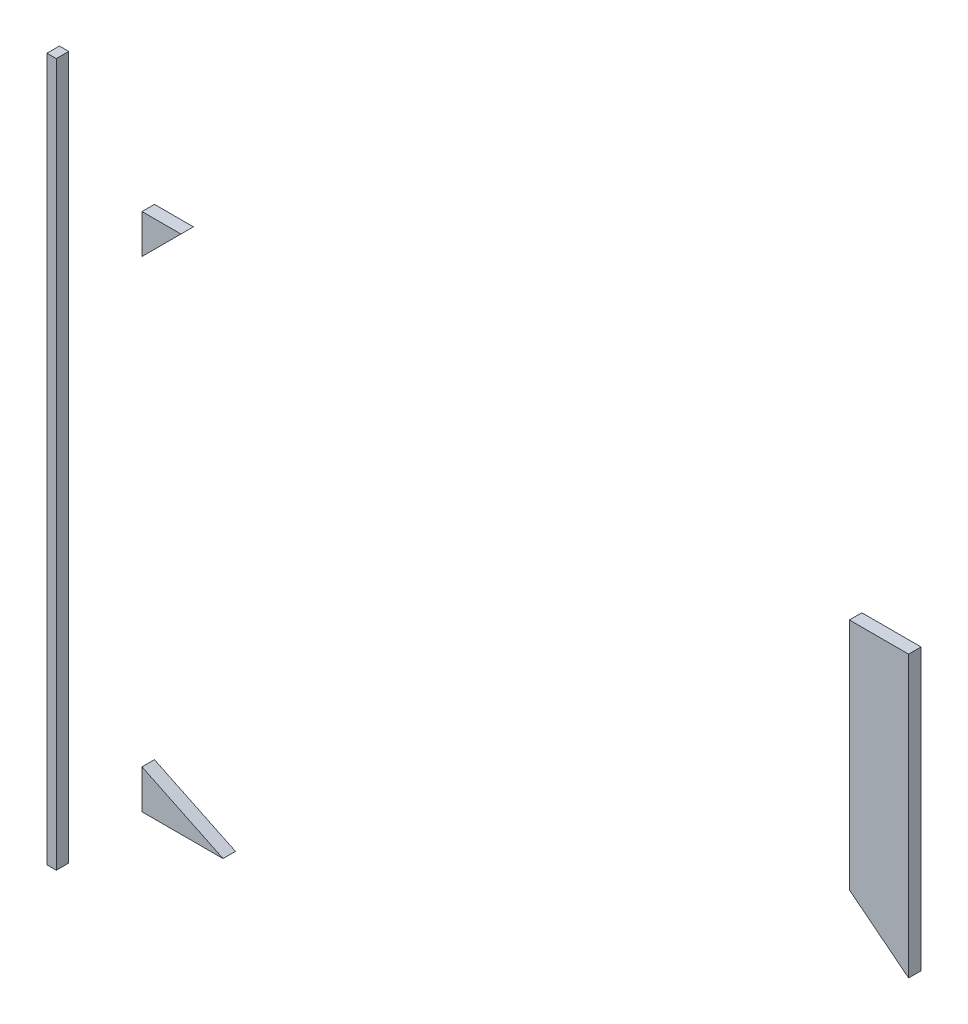
ISO-10303-21;
HEADER;
FILE_DESCRIPTION(('STEP AP214'),'2;1');
FILE_NAME('part.step','',(''),(''),'','','');
FILE_SCHEMA(('AUTOMOTIVE_DESIGN { 1 0 10303 214 1 1 1 1 }'));
ENDSEC;
DATA;
#1=APPLICATION_CONTEXT('core data for automotive mechanical design processes');
#2=APPLICATION_PROTOCOL_DEFINITION('international standard','automotive_design',2000,#1);
#3=PRODUCT_CONTEXT('',#1,'mechanical');
#4=PRODUCT('Part','Part','',(#3));
#5=PRODUCT_RELATED_PRODUCT_CATEGORY('part','',(#4));
#6=PRODUCT_DEFINITION_FORMATION('','',#4);
#7=PRODUCT_DEFINITION_CONTEXT('part definition',#1,'design');
#8=PRODUCT_DEFINITION('design','',#6,#7);
#9=PRODUCT_DEFINITION_SHAPE('','',#8);
#10=(LENGTH_UNIT() NAMED_UNIT(*) SI_UNIT(.MILLI.,.METRE.));
#11=(NAMED_UNIT(*) PLANE_ANGLE_UNIT() SI_UNIT($,.RADIAN.));
#12=(NAMED_UNIT(*) SI_UNIT($,.STERADIAN.) SOLID_ANGLE_UNIT());
#13=UNCERTAINTY_MEASURE_WITH_UNIT(LENGTH_MEASURE(1.E-05),#10,'distance_accuracy_value','');
#14=(GEOMETRIC_REPRESENTATION_CONTEXT(3) GLOBAL_UNCERTAINTY_ASSIGNED_CONTEXT((#13)) GLOBAL_UNIT_ASSIGNED_CONTEXT((#10,
#11,#12)) REPRESENTATION_CONTEXT('',''));
#15=CARTESIAN_POINT('',(0.,0.,0.));
#16=DIRECTION('',(0.,0.,1.));
#17=DIRECTION('',(1.,0.,0.));
#18=AXIS2_PLACEMENT_3D('',#15,#16,#17);
#19=CARTESIAN_POINT('',(-85.4999999848123,-45.4909497582359,0.));
#20=DIRECTION('',(1.,0.,0.));
#21=DIRECTION('',(0.,0.,-1.));
#22=AXIS2_PLACEMENT_3D('',#19,#20,#21);
#23=PLANE('',#22);
#24=DIRECTION('',(0.,1.,0.));
#25=VECTOR('',#24,1.);
#26=CARTESIAN_POINT('',(-85.4999999848123,-45.4909497582359,8.));
#27=LINE('',#26,#25);
#28=CARTESIAN_POINT('',(-85.4999999848123,-45.4909497582359,8.));
#29=VERTEX_POINT('',#28);
#30=CARTESIAN_POINT('',(-85.4999999848123,405.641377992683,8.));
#31=VERTEX_POINT('',#30);
#32=EDGE_CURVE('E110',#29,#31,#27,.T.);
#33=ORIENTED_EDGE('',*,*,#32,.F.);
#34=DIRECTION('',(0.,0.,1.));
#35=VECTOR('',#34,1.);
#36=CARTESIAN_POINT('',(-85.4999999848123,-45.4909497582359,0.));
#37=LINE('',#36,#35);
#38=CARTESIAN_POINT('',(-85.4999999848123,-45.4909497582359,0.));
#39=VERTEX_POINT('',#38);
#40=EDGE_CURVE('E12',#39,#29,#37,.T.);
#41=ORIENTED_EDGE('',*,*,#40,.F.);
#42=DIRECTION('',(0.,1.,0.));
#43=VECTOR('',#42,1.);
#44=CARTESIAN_POINT('',(-85.4999999848123,-45.4909497582359,0.));
#45=LINE('',#44,#43);
#46=CARTESIAN_POINT('',(-85.4999999848123,405.641377992683,0.));
#47=VERTEX_POINT('',#46);
#48=EDGE_CURVE('E104',#39,#47,#45,.T.);
#49=ORIENTED_EDGE('',*,*,#48,.T.);
#50=DIRECTION('',(0.,0.,1.));
#51=VECTOR('',#50,1.);
#52=CARTESIAN_POINT('',(-85.4999999848123,405.641377992683,0.));
#53=LINE('',#52,#51);
#54=EDGE_CURVE('E49',#47,#31,#53,.T.);
#55=ORIENTED_EDGE('',*,*,#54,.T.);
#56=EDGE_LOOP('',(#33,#41,#49,#55));
#57=FACE_BOUND('',#56,.T.);
#58=ADVANCED_FACE('F46',(#57),#23,.T.);
#59=CARTESIAN_POINT('',(-85.4999999848123,-45.4909497582359,0.));
#60=DIRECTION('',(0.,-1.,0.));
#61=DIRECTION('',(0.,0.,-1.));
#62=AXIS2_PLACEMENT_3D('',#59,#60,#61);
#63=PLANE('',#62);
#64=DIRECTION('',(1.,0.,0.));
#65=VECTOR('',#64,1.);
#66=CARTESIAN_POINT('',(-85.4999999848123,-45.4909497582359,8.));
#67=LINE('',#66,#65);
#68=CARTESIAN_POINT('',(-91.4999999848118,-45.4909497582359,8.));
#69=VERTEX_POINT('',#68);
#70=EDGE_CURVE('E106',#69,#29,#67,.T.);
#71=ORIENTED_EDGE('',*,*,#70,.F.);
#72=DIRECTION('',(0.,0.,1.));
#73=VECTOR('',#72,1.);
#74=CARTESIAN_POINT('',(-91.4999999848118,-45.4909497582359,0.));
#75=LINE('',#74,#73);
#76=CARTESIAN_POINT('',(-91.4999999848118,-45.4909497582359,0.));
#77=VERTEX_POINT('',#76);
#78=EDGE_CURVE('E55',#77,#69,#75,.T.);
#79=ORIENTED_EDGE('',*,*,#78,.F.);
#80=DIRECTION('',(1.,0.,0.));
#81=VECTOR('',#80,1.);
#82=CARTESIAN_POINT('',(-85.4999999848123,-45.4909497582359,0.));
#83=LINE('',#82,#81);
#84=EDGE_CURVE('E101',#77,#39,#83,.T.);
#85=ORIENTED_EDGE('',*,*,#84,.T.);
#86=ORIENTED_EDGE('',*,*,#40,.T.);
#87=EDGE_LOOP('',(#71,#79,#85,#86));
#88=FACE_BOUND('',#87,.T.);
#89=ADVANCED_FACE('F120',(#88),#63,.T.);
#90=CARTESIAN_POINT('',(-91.4999999848118,-45.4909497582359,0.));
#91=DIRECTION('',(-1.,0.,0.));
#92=DIRECTION('',(0.,0.,1.));
#93=AXIS2_PLACEMENT_3D('',#90,#91,#92);
#94=PLANE('',#93);
#95=DIRECTION('',(0.,-1.,0.));
#96=VECTOR('',#95,1.);
#97=CARTESIAN_POINT('',(-91.4999999848118,-45.4909497582359,8.));
#98=LINE('',#97,#96);
#99=CARTESIAN_POINT('',(-91.4999999848118,405.641377992683,8.));
#100=VERTEX_POINT('',#99);
#101=EDGE_CURVE('E96',#100,#69,#98,.T.);
#102=ORIENTED_EDGE('',*,*,#101,.F.);
#103=DIRECTION('',(0.,0.,1.));
#104=VECTOR('',#103,1.);
#105=CARTESIAN_POINT('',(-91.4999999848118,405.641377992683,0.));
#106=LINE('',#105,#104);
#107=CARTESIAN_POINT('',(-91.4999999848118,405.641377992683,0.));
#108=VERTEX_POINT('',#107);
#109=EDGE_CURVE('E91',#108,#100,#106,.T.);
#110=ORIENTED_EDGE('',*,*,#109,.F.);
#111=DIRECTION('',(0.,-1.,0.));
#112=VECTOR('',#111,1.);
#113=CARTESIAN_POINT('',(-91.4999999848118,-45.4909497582359,0.));
#114=LINE('',#113,#112);
#115=EDGE_CURVE('E94',#108,#77,#114,.T.);
#116=ORIENTED_EDGE('',*,*,#115,.T.);
#117=ORIENTED_EDGE('',*,*,#78,.T.);
#118=EDGE_LOOP('',(#102,#110,#116,#117));
#119=FACE_BOUND('',#118,.T.);
#120=ADVANCED_FACE('F93',(#119),#94,.T.);
#121=CARTESIAN_POINT('',(-85.4999999848123,405.641377992683,0.));
#122=DIRECTION('',(0.,1.,0.));
#123=DIRECTION('',(0.,0.,1.));
#124=AXIS2_PLACEMENT_3D('',#121,#122,#123);
#125=PLANE('',#124);
#126=DIRECTION('',(-1.,0.,0.));
#127=VECTOR('',#126,1.);
#128=CARTESIAN_POINT('',(-85.4999999848123,405.641377992683,8.));
#129=LINE('',#128,#127);
#130=EDGE_CURVE('E113',#31,#100,#129,.T.);
#131=ORIENTED_EDGE('',*,*,#130,.F.);
#132=ORIENTED_EDGE('',*,*,#54,.F.);
#133=DIRECTION('',(-1.,0.,0.));
#134=VECTOR('',#133,1.);
#135=CARTESIAN_POINT('',(-85.4999999848123,405.641377992683,0.));
#136=LINE('',#135,#134);
#137=EDGE_CURVE('E100',#47,#108,#136,.T.);
#138=ORIENTED_EDGE('',*,*,#137,.T.);
#139=ORIENTED_EDGE('',*,*,#109,.T.);
#140=EDGE_LOOP('',(#131,#132,#138,#139));
#141=FACE_BOUND('',#140,.T.);
#142=ADVANCED_FACE('F103',(#141),#125,.T.);
#143=CARTESIAN_POINT('',(0.,0.,0.));
#144=DIRECTION('',(0.,0.,1.));
#145=DIRECTION('',(1.,0.,0.));
#146=AXIS2_PLACEMENT_3D('',#143,#144,#145);
#147=PLANE('',#146);
#148=ORIENTED_EDGE('',*,*,#48,.F.);
#149=ORIENTED_EDGE('',*,*,#84,.F.);
#150=ORIENTED_EDGE('',*,*,#115,.F.);
#151=ORIENTED_EDGE('',*,*,#137,.F.);
#152=EDGE_LOOP('',(#148,#149,#150,#151));
#153=FACE_BOUND('',#152,.T.);
#154=ADVANCED_FACE('F99',(#153),#147,.F.);
#155=CARTESIAN_POINT('',(0.,0.,8.));
#156=DIRECTION('',(0.,0.,1.));
#157=DIRECTION('',(1.,0.,0.));
#158=AXIS2_PLACEMENT_3D('',#155,#156,#157);
#159=PLANE('',#158);
#160=ORIENTED_EDGE('',*,*,#32,.T.);
#161=ORIENTED_EDGE('',*,*,#130,.T.);
#162=ORIENTED_EDGE('',*,*,#101,.T.);
#163=ORIENTED_EDGE('',*,*,#70,.T.);
#164=EDGE_LOOP('',(#160,#161,#162,#163));
#165=FACE_BOUND('',#164,.T.);
#166=ADVANCED_FACE('F119',(#165),#159,.T.);
#167=CLOSED_SHELL('',(#58,#89,#120,#142,#154,#166));
#168=MANIFOLD_SOLID_BREP('B2',#167);
#169=CARTESIAN_POINT('',(461.500000011823,348.138361245429,0.));
#170=DIRECTION('',(0.,1.,0.));
#171=DIRECTION('',(0.,0.,1.));
#172=AXIS2_PLACEMENT_3D('',#169,#170,#171);
#173=PLANE('',#172);
#174=DIRECTION('',(-1.,0.,0.));
#175=VECTOR('',#174,1.);
#176=CARTESIAN_POINT('',(461.500000011823,348.138361245429,8.));
#177=LINE('',#176,#175);
#178=CARTESIAN_POINT('',(461.500000011823,348.138361245429,8.));
#179=VERTEX_POINT('',#178);
#180=CARTESIAN_POINT('',(423.500000015184,348.138361245429,8.));
#181=VERTEX_POINT('',#180);
#182=EDGE_CURVE('E246',#179,#181,#177,.T.);
#183=ORIENTED_EDGE('',*,*,#182,.F.);
#184=DIRECTION('',(0.,0.,1.));
#185=VECTOR('',#184,1.);
#186=CARTESIAN_POINT('',(461.500000011823,348.138361245429,0.));
#187=LINE('',#186,#185);
#188=CARTESIAN_POINT('',(461.500000011823,348.138361245429,0.));
#189=VERTEX_POINT('',#188);
#190=EDGE_CURVE('E44',#189,#179,#187,.T.);
#191=ORIENTED_EDGE('',*,*,#190,.F.);
#192=DIRECTION('',(-1.,0.,0.));
#193=VECTOR('',#192,1.);
#194=CARTESIAN_POINT('',(461.500000011823,348.138361245429,0.));
#195=LINE('',#194,#193);
#196=CARTESIAN_POINT('',(423.500000015184,348.138361245429,0.));
#197=VERTEX_POINT('',#196);
#198=EDGE_CURVE('E240',#189,#197,#195,.T.);
#199=ORIENTED_EDGE('',*,*,#198,.T.);
#200=DIRECTION('',(0.,0.,1.));
#201=VECTOR('',#200,1.);
#202=CARTESIAN_POINT('',(423.500000015184,348.138361245429,0.));
#203=LINE('',#202,#201);
#204=EDGE_CURVE('E185',#197,#181,#203,.T.);
#205=ORIENTED_EDGE('',*,*,#204,.T.);
#206=EDGE_LOOP('',(#183,#191,#199,#205));
#207=FACE_BOUND('',#206,.T.);
#208=ADVANCED_FACE('F182',(#207),#173,.T.);
#209=CARTESIAN_POINT('',(461.500000015184,168.138361245429,0.));
#210=DIRECTION('',(1.,1.86739512741951E-11,0.));
#211=DIRECTION('',(-1.86739512741951E-11,1.,0.));
#212=AXIS2_PLACEMENT_3D('',#209,#210,#211);
#213=PLANE('',#212);
#214=DIRECTION('',(-1.86739512741951E-11,1.,0.));
#215=VECTOR('',#214,1.);
#216=CARTESIAN_POINT('',(461.500000015184,168.138361245429,8.));
#217=LINE('',#216,#215);
#218=CARTESIAN_POINT('',(461.500000015184,168.138361245429,8.));
#219=VERTEX_POINT('',#218);
#220=EDGE_CURVE('E242',#219,#179,#217,.T.);
#221=ORIENTED_EDGE('',*,*,#220,.F.);
#222=DIRECTION('',(0.,0.,1.));
#223=VECTOR('',#222,1.);
#224=CARTESIAN_POINT('',(461.500000015184,168.138361245429,0.));
#225=LINE('',#224,#223);
#226=CARTESIAN_POINT('',(461.500000015184,168.138361245429,0.));
#227=VERTEX_POINT('',#226);
#228=EDGE_CURVE('E191',#227,#219,#225,.T.);
#229=ORIENTED_EDGE('',*,*,#228,.F.);
#230=DIRECTION('',(-1.86739512741951E-11,1.,0.));
#231=VECTOR('',#230,1.);
#232=CARTESIAN_POINT('',(461.500000015184,168.138361245429,0.));
#233=LINE('',#232,#231);
#234=EDGE_CURVE('E237',#227,#189,#233,.T.);
#235=ORIENTED_EDGE('',*,*,#234,.T.);
#236=ORIENTED_EDGE('',*,*,#190,.T.);
#237=EDGE_LOOP('',(#221,#229,#235,#236));
#238=FACE_BOUND('',#237,.T.);
#239=ADVANCED_FACE('F256',(#238),#213,.T.);
#240=CARTESIAN_POINT('',(423.500000015184,198.138361245429,0.));
#241=DIRECTION('',(-0.619644288579021,-0.784882765533426,0.));
#242=DIRECTION('',(0.784882765533426,-0.619644288579021,0.));
#243=AXIS2_PLACEMENT_3D('',#240,#241,#242);
#244=PLANE('',#243);
#245=DIRECTION('',(0.784882765533426,-0.619644288579021,0.));
#246=VECTOR('',#245,1.);
#247=CARTESIAN_POINT('',(423.500000015184,198.138361245429,8.));
#248=LINE('',#247,#246);
#249=CARTESIAN_POINT('',(423.500000015184,198.138361245429,8.));
#250=VERTEX_POINT('',#249);
#251=EDGE_CURVE('E232',#250,#219,#248,.T.);
#252=ORIENTED_EDGE('',*,*,#251,.F.);
#253=DIRECTION('',(0.,0.,1.));
#254=VECTOR('',#253,1.);
#255=CARTESIAN_POINT('',(423.500000015184,198.138361245429,0.));
#256=LINE('',#255,#254);
#257=CARTESIAN_POINT('',(423.500000015184,198.138361245429,0.));
#258=VERTEX_POINT('',#257);
#259=EDGE_CURVE('E227',#258,#250,#256,.T.);
#260=ORIENTED_EDGE('',*,*,#259,.F.);
#261=DIRECTION('',(0.784882765533426,-0.619644288579021,0.));
#262=VECTOR('',#261,1.);
#263=CARTESIAN_POINT('',(423.500000015184,198.138361245429,0.));
#264=LINE('',#263,#262);
#265=EDGE_CURVE('E230',#258,#227,#264,.T.);
#266=ORIENTED_EDGE('',*,*,#265,.T.);
#267=ORIENTED_EDGE('',*,*,#228,.T.);
#268=EDGE_LOOP('',(#252,#260,#266,#267));
#269=FACE_BOUND('',#268,.T.);
#270=ADVANCED_FACE('F229',(#269),#244,.T.);
#271=CARTESIAN_POINT('',(423.500000015184,348.138361245429,0.));
#272=DIRECTION('',(-1.,0.,0.));
#273=DIRECTION('',(0.,0.,1.));
#274=AXIS2_PLACEMENT_3D('',#271,#272,#273);
#275=PLANE('',#274);
#276=DIRECTION('',(0.,-1.,0.));
#277=VECTOR('',#276,1.);
#278=CARTESIAN_POINT('',(423.500000015184,348.138361245429,8.));
#279=LINE('',#278,#277);
#280=EDGE_CURVE('E249',#181,#250,#279,.T.);
#281=ORIENTED_EDGE('',*,*,#280,.F.);
#282=ORIENTED_EDGE('',*,*,#204,.F.);
#283=DIRECTION('',(0.,-1.,0.));
#284=VECTOR('',#283,1.);
#285=CARTESIAN_POINT('',(423.500000015184,348.138361245429,0.));
#286=LINE('',#285,#284);
#287=EDGE_CURVE('E236',#197,#258,#286,.T.);
#288=ORIENTED_EDGE('',*,*,#287,.T.);
#289=ORIENTED_EDGE('',*,*,#259,.T.);
#290=EDGE_LOOP('',(#281,#282,#288,#289));
#291=FACE_BOUND('',#290,.T.);
#292=ADVANCED_FACE('F239',(#291),#275,.T.);
#293=CARTESIAN_POINT('',(0.,0.,0.));
#294=DIRECTION('',(0.,0.,1.));
#295=DIRECTION('',(1.,0.,0.));
#296=AXIS2_PLACEMENT_3D('',#293,#294,#295);
#297=PLANE('',#296);
#298=ORIENTED_EDGE('',*,*,#198,.F.);
#299=ORIENTED_EDGE('',*,*,#234,.F.);
#300=ORIENTED_EDGE('',*,*,#265,.F.);
#301=ORIENTED_EDGE('',*,*,#287,.F.);
#302=EDGE_LOOP('',(#298,#299,#300,#301));
#303=FACE_BOUND('',#302,.T.);
#304=ADVANCED_FACE('F235',(#303),#297,.F.);
#305=CARTESIAN_POINT('',(0.,0.,8.));
#306=DIRECTION('',(0.,0.,1.));
#307=DIRECTION('',(1.,0.,0.));
#308=AXIS2_PLACEMENT_3D('',#305,#306,#307);
#309=PLANE('',#308);
#310=ORIENTED_EDGE('',*,*,#182,.T.);
#311=ORIENTED_EDGE('',*,*,#280,.T.);
#312=ORIENTED_EDGE('',*,*,#251,.T.);
#313=ORIENTED_EDGE('',*,*,#220,.T.);
#314=EDGE_LOOP('',(#310,#311,#312,#313));
#315=FACE_BOUND('',#314,.T.);
#316=ADVANCED_FACE('F255',(#315),#309,.T.);
#317=CLOSED_SHELL('',(#208,#239,#270,#292,#304,#316));
#318=MANIFOLD_SOLID_BREP('B6',#317);
#319=CARTESIAN_POINT('',(-30.4999999881738,348.138361245429,0.));
#320=DIRECTION('',(-1.,0.,0.));
#321=DIRECTION('',(0.,-1.,0.));
#322=AXIS2_PLACEMENT_3D('',#319,#320,#321);
#323=PLANE('',#322);
#324=DIRECTION('',(0.,-1.,0.));
#325=VECTOR('',#324,1.);
#326=CARTESIAN_POINT('',(-30.4999999881738,348.138361245429,8.));
#327=LINE('',#326,#325);
#328=CARTESIAN_POINT('',(-30.4999999881738,348.138361245429,8.));
#329=VERTEX_POINT('',#328);
#330=CARTESIAN_POINT('',(-30.4999999881738,323.138361245429,8.));
#331=VERTEX_POINT('',#330);
#332=EDGE_CURVE('E371',#329,#331,#327,.T.);
#333=ORIENTED_EDGE('',*,*,#332,.F.);
#334=DIRECTION('',(0.,0.,1.));
#335=VECTOR('',#334,1.);
#336=CARTESIAN_POINT('',(-30.4999999881738,348.138361245429,0.));
#337=LINE('',#336,#335);
#338=CARTESIAN_POINT('',(-30.4999999881738,348.138361245429,0.));
#339=VERTEX_POINT('',#338);
#340=EDGE_CURVE('E180',#339,#329,#337,.T.);
#341=ORIENTED_EDGE('',*,*,#340,.F.);
#342=DIRECTION('',(0.,-1.,0.));
#343=VECTOR('',#342,1.);
#344=CARTESIAN_POINT('',(-30.4999999881738,348.138361245429,0.));
#345=LINE('',#344,#343);
#346=CARTESIAN_POINT('',(-30.4999999881738,323.138361245429,0.));
#347=VERTEX_POINT('',#346);
#348=EDGE_CURVE('E363',#339,#347,#345,.T.);
#349=ORIENTED_EDGE('',*,*,#348,.T.);
#350=DIRECTION('',(0.,0.,1.));
#351=VECTOR('',#350,1.);
#352=CARTESIAN_POINT('',(-30.4999999881738,323.138361245429,0.));
#353=LINE('',#352,#351);
#354=EDGE_CURVE('E322',#347,#331,#353,.T.);
#355=ORIENTED_EDGE('',*,*,#354,.T.);
#356=EDGE_LOOP('',(#333,#341,#349,#355));
#357=FACE_BOUND('',#356,.T.);
#358=ADVANCED_FACE('F319',(#357),#323,.T.);
#359=CARTESIAN_POINT('',(-5.49999998817376,348.138361245429,0.));
#360=DIRECTION('',(0.,1.,0.));
#361=DIRECTION('',(0.,0.,1.));
#362=AXIS2_PLACEMENT_3D('',#359,#360,#361);
#363=PLANE('',#362);
#364=DIRECTION('',(-1.,0.,0.));
#365=VECTOR('',#364,1.);
#366=CARTESIAN_POINT('',(-5.49999998817376,348.138361245429,8.));
#367=LINE('',#366,#365);
#368=CARTESIAN_POINT('',(-5.49999998817376,348.138361245429,8.));
#369=VERTEX_POINT('',#368);
#370=EDGE_CURVE('E365',#369,#329,#367,.T.);
#371=ORIENTED_EDGE('',*,*,#370,.F.);
#372=DIRECTION('',(0.,0.,1.));
#373=VECTOR('',#372,1.);
#374=CARTESIAN_POINT('',(-5.49999998817376,348.138361245429,0.));
#375=LINE('',#374,#373);
#376=CARTESIAN_POINT('',(-5.49999998817376,348.138361245429,0.));
#377=VERTEX_POINT('',#376);
#378=EDGE_CURVE('E328',#377,#369,#375,.T.);
#379=ORIENTED_EDGE('',*,*,#378,.F.);
#380=DIRECTION('',(-1.,0.,0.));
#381=VECTOR('',#380,1.);
#382=CARTESIAN_POINT('',(-5.49999998817376,348.138361245429,0.));
#383=LINE('',#382,#381);
#384=EDGE_CURVE('E360',#377,#339,#383,.T.);
#385=ORIENTED_EDGE('',*,*,#384,.T.);
#386=ORIENTED_EDGE('',*,*,#340,.T.);
#387=EDGE_LOOP('',(#371,#379,#385,#386));
#388=FACE_BOUND('',#387,.T.);
#389=ADVANCED_FACE('F375',(#388),#363,.T.);
#390=CARTESIAN_POINT('',(-30.4999999881738,323.138361245429,0.));
#391=DIRECTION('',(0.707106781186548,-0.707106781186547,0.));
#392=DIRECTION('',(0.707106781186547,0.707106781186548,0.));
#393=AXIS2_PLACEMENT_3D('',#390,#391,#392);
#394=PLANE('',#393);
#395=DIRECTION('',(0.707106781186547,0.707106781186548,0.));
#396=VECTOR('',#395,1.);
#397=CARTESIAN_POINT('',(-30.4999999881738,323.138361245429,8.));
#398=LINE('',#397,#396);
#399=EDGE_CURVE('E358',#331,#369,#398,.T.);
#400=ORIENTED_EDGE('',*,*,#399,.F.);
#401=ORIENTED_EDGE('',*,*,#354,.F.);
#402=DIRECTION('',(0.707106781186547,0.707106781186548,0.));
#403=VECTOR('',#402,1.);
#404=CARTESIAN_POINT('',(-30.4999999881738,323.138361245429,0.));
#405=LINE('',#404,#403);
#406=EDGE_CURVE('E356',#347,#377,#405,.T.);
#407=ORIENTED_EDGE('',*,*,#406,.T.);
#408=ORIENTED_EDGE('',*,*,#378,.T.);
#409=EDGE_LOOP('',(#400,#401,#407,#408));
#410=FACE_BOUND('',#409,.T.);
#411=ADVANCED_FACE('F355',(#410),#394,.T.);
#412=CARTESIAN_POINT('',(0.,0.,0.));
#413=DIRECTION('',(0.,0.,-1.));
#414=DIRECTION('',(-1.,0.,0.));
#415=AXIS2_PLACEMENT_3D('',#412,#413,#414);
#416=PLANE('',#415);
#417=ORIENTED_EDGE('',*,*,#348,.F.);
#418=ORIENTED_EDGE('',*,*,#384,.F.);
#419=ORIENTED_EDGE('',*,*,#406,.F.);
#420=EDGE_LOOP('',(#417,#418,#419));
#421=FACE_BOUND('',#420,.T.);
#422=ADVANCED_FACE('F362',(#421),#416,.T.);
#423=CARTESIAN_POINT('',(0.,0.,8.));
#424=DIRECTION('',(0.,0.,-1.));
#425=DIRECTION('',(-1.,0.,0.));
#426=AXIS2_PLACEMENT_3D('',#423,#424,#425);
#427=PLANE('',#426);
#428=ORIENTED_EDGE('',*,*,#332,.T.);
#429=ORIENTED_EDGE('',*,*,#399,.T.);
#430=ORIENTED_EDGE('',*,*,#370,.T.);
#431=EDGE_LOOP('',(#428,#429,#430));
#432=FACE_BOUND('',#431,.T.);
#433=ADVANCED_FACE('F374',(#432),#427,.F.);
#434=CLOSED_SHELL('',(#358,#389,#411,#422,#433));
#435=MANIFOLD_SOLID_BREP('B38',#434);
#436=CARTESIAN_POINT('',(-30.4999999848125,14.5090502417639,0.));
#437=DIRECTION('',(-1.,-1.34452310396327E-10,0.));
#438=DIRECTION('',(1.34452310396327E-10,-1.,0.));
#439=AXIS2_PLACEMENT_3D('',#436,#437,#438);
#440=PLANE('',#439);
#441=DIRECTION('',(1.34452310396327E-10,-1.,0.));
#442=VECTOR('',#441,1.);
#443=CARTESIAN_POINT('',(-30.4999999848125,14.5090502417639,8.));
#444=LINE('',#443,#442);
#445=CARTESIAN_POINT('',(-30.4999999881738,39.5090502417639,8.));
#446=VERTEX_POINT('',#445);
#447=CARTESIAN_POINT('',(-30.4999999848125,14.5090502417639,8.));
#448=VERTEX_POINT('',#447);
#449=EDGE_CURVE('E471',#446,#448,#444,.T.);
#450=ORIENTED_EDGE('',*,*,#449,.F.);
#451=DIRECTION('',(0.,0.,1.));
#452=VECTOR('',#451,1.);
#453=CARTESIAN_POINT('',(-30.4999999881738,39.5090502417639,0.));
#454=LINE('',#453,#452);
#455=CARTESIAN_POINT('',(-30.4999999881738,39.5090502417639,0.));
#456=VERTEX_POINT('',#455);
#457=EDGE_CURVE('E317',#456,#446,#454,.T.);
#458=ORIENTED_EDGE('',*,*,#457,.F.);
#459=DIRECTION('',(1.34452310396327E-10,-1.,0.));
#460=VECTOR('',#459,1.);
#461=CARTESIAN_POINT('',(-30.4999999848125,14.5090502417639,0.));
#462=LINE('',#461,#460);
#463=CARTESIAN_POINT('',(-30.4999999848125,14.5090502417639,0.));
#464=VERTEX_POINT('',#463);
#465=EDGE_CURVE('E463',#456,#464,#462,.T.);
#466=ORIENTED_EDGE('',*,*,#465,.T.);
#467=DIRECTION('',(0.,0.,1.));
#468=VECTOR('',#467,1.);
#469=CARTESIAN_POINT('',(-30.4999999848125,14.5090502417639,0.));
#470=LINE('',#469,#468);
#471=EDGE_CURVE('E422',#464,#448,#470,.T.);
#472=ORIENTED_EDGE('',*,*,#471,.T.);
#473=EDGE_LOOP('',(#450,#458,#466,#472));
#474=FACE_BOUND('',#473,.T.);
#475=ADVANCED_FACE('F419',(#474),#440,.T.);
#476=CARTESIAN_POINT('',(-30.4999999881738,39.5090502417639,0.));
#477=DIRECTION('',(0.433294434845128,0.901252424536124,0.));
#478=DIRECTION('',(-0.901252424536124,0.433294434845128,0.));
#479=AXIS2_PLACEMENT_3D('',#476,#477,#478);
#480=PLANE('',#479);
#481=DIRECTION('',(-0.901252424536124,0.433294434845128,0.));
#482=VECTOR('',#481,1.);
#483=CARTESIAN_POINT('',(-30.4999999881738,39.5090502417639,8.));
#484=LINE('',#483,#482);
#485=CARTESIAN_POINT('',(21.5000000151875,14.5090502417639,8.));
#486=VERTEX_POINT('',#485);
#487=EDGE_CURVE('E465',#486,#446,#484,.T.);
#488=ORIENTED_EDGE('',*,*,#487,.F.);
#489=DIRECTION('',(0.,0.,1.));
#490=VECTOR('',#489,1.);
#491=CARTESIAN_POINT('',(21.5000000151875,14.5090502417639,0.));
#492=LINE('',#491,#490);
#493=CARTESIAN_POINT('',(21.5000000151875,14.5090502417639,0.));
#494=VERTEX_POINT('',#493);
#495=EDGE_CURVE('E428',#494,#486,#492,.T.);
#496=ORIENTED_EDGE('',*,*,#495,.F.);
#497=DIRECTION('',(-0.901252424536124,0.433294434845128,0.));
#498=VECTOR('',#497,1.);
#499=CARTESIAN_POINT('',(-30.4999999881738,39.5090502417639,0.));
#500=LINE('',#499,#498);
#501=EDGE_CURVE('E460',#494,#456,#500,.T.);
#502=ORIENTED_EDGE('',*,*,#501,.T.);
#503=ORIENTED_EDGE('',*,*,#457,.T.);
#504=EDGE_LOOP('',(#488,#496,#502,#503));
#505=FACE_BOUND('',#504,.T.);
#506=ADVANCED_FACE('F475',(#505),#480,.T.);
#507=CARTESIAN_POINT('',(21.5000000151875,14.5090502417639,0.));
#508=DIRECTION('',(0.,-1.,0.));
#509=DIRECTION('',(0.,0.,-1.));
#510=AXIS2_PLACEMENT_3D('',#507,#508,#509);
#511=PLANE('',#510);
#512=DIRECTION('',(1.,0.,0.));
#513=VECTOR('',#512,1.);
#514=CARTESIAN_POINT('',(21.5000000151875,14.5090502417639,8.));
#515=LINE('',#514,#513);
#516=EDGE_CURVE('E458',#448,#486,#515,.T.);
#517=ORIENTED_EDGE('',*,*,#516,.F.);
#518=ORIENTED_EDGE('',*,*,#471,.F.);
#519=DIRECTION('',(1.,0.,0.));
#520=VECTOR('',#519,1.);
#521=CARTESIAN_POINT('',(21.5000000151875,14.5090502417639,0.));
#522=LINE('',#521,#520);
#523=EDGE_CURVE('E456',#464,#494,#522,.T.);
#524=ORIENTED_EDGE('',*,*,#523,.T.);
#525=ORIENTED_EDGE('',*,*,#495,.T.);
#526=EDGE_LOOP('',(#517,#518,#524,#525));
#527=FACE_BOUND('',#526,.T.);
#528=ADVANCED_FACE('F455',(#527),#511,.T.);
#529=CARTESIAN_POINT('',(0.,0.,0.));
#530=DIRECTION('',(0.,0.,1.));
#531=DIRECTION('',(1.,0.,0.));
#532=AXIS2_PLACEMENT_3D('',#529,#530,#531);
#533=PLANE('',#532);
#534=ORIENTED_EDGE('',*,*,#465,.F.);
#535=ORIENTED_EDGE('',*,*,#501,.F.);
#536=ORIENTED_EDGE('',*,*,#523,.F.);
#537=EDGE_LOOP('',(#534,#535,#536));
#538=FACE_BOUND('',#537,.T.);
#539=ADVANCED_FACE('F462',(#538),#533,.F.);
#540=CARTESIAN_POINT('',(0.,0.,8.));
#541=DIRECTION('',(0.,0.,1.));
#542=DIRECTION('',(1.,0.,0.));
#543=AXIS2_PLACEMENT_3D('',#540,#541,#542);
#544=PLANE('',#543);
#545=ORIENTED_EDGE('',*,*,#449,.T.);
#546=ORIENTED_EDGE('',*,*,#516,.T.);
#547=ORIENTED_EDGE('',*,*,#487,.T.);
#548=EDGE_LOOP('',(#545,#546,#547));
#549=FACE_BOUND('',#548,.T.);
#550=ADVANCED_FACE('F474',(#549),#544,.T.);
#551=CLOSED_SHELL('',(#475,#506,#528,#539,#550));
#552=MANIFOLD_SOLID_BREP('B174',#551);
#553=ADVANCED_BREP_SHAPE_REPRESENTATION('',(#18,#168,#318,#435,#552),#14);
#554=SHAPE_DEFINITION_REPRESENTATION(#9,#553);
ENDSEC;
END-ISO-10303-21;
